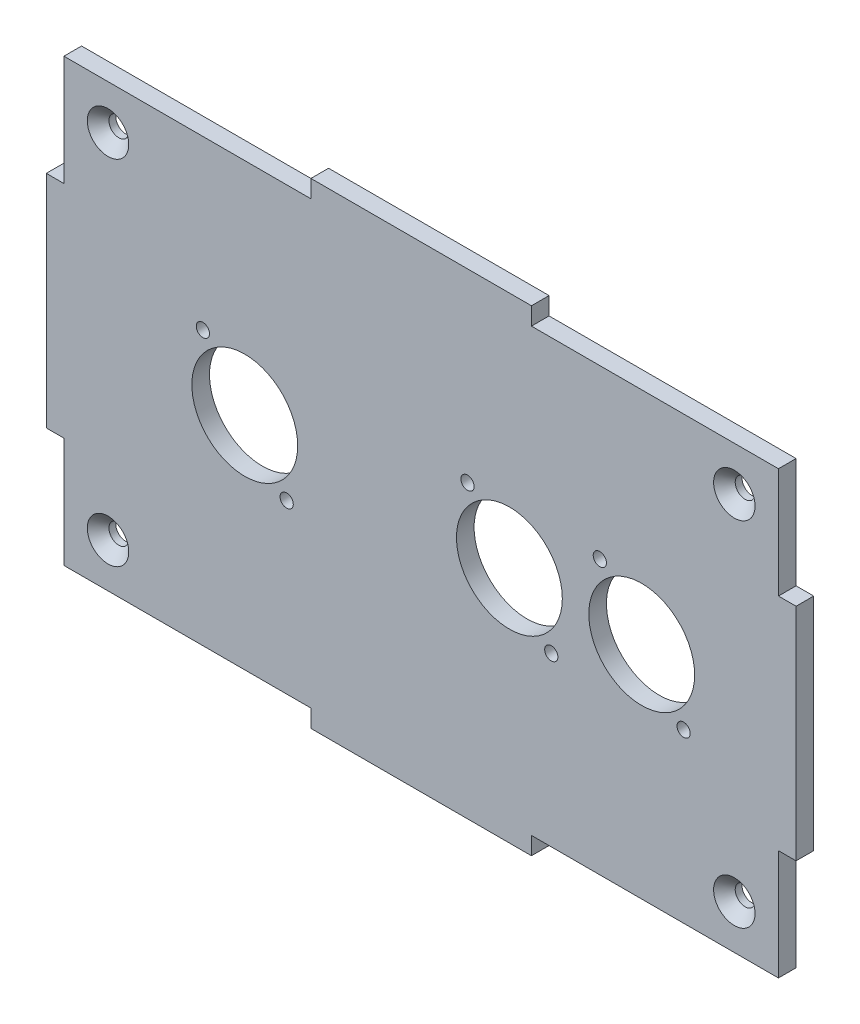
ISO-10303-21;
HEADER;
FILE_DESCRIPTION(('STEP AP214'),'2;1');
FILE_NAME('part.step','',(''),(''),'','','');
FILE_SCHEMA(('AUTOMOTIVE_DESIGN { 1 0 10303 214 1 1 1 1 }'));
ENDSEC;
DATA;
#1=APPLICATION_CONTEXT('core data for automotive mechanical design processes');
#2=APPLICATION_PROTOCOL_DEFINITION('international standard','automotive_design',2000,#1);
#3=PRODUCT_CONTEXT('',#1,'mechanical');
#4=PRODUCT('Part','Part','',(#3));
#5=PRODUCT_RELATED_PRODUCT_CATEGORY('part','',(#4));
#6=PRODUCT_DEFINITION_FORMATION('','',#4);
#7=PRODUCT_DEFINITION_CONTEXT('part definition',#1,'design');
#8=PRODUCT_DEFINITION('design','',#6,#7);
#9=PRODUCT_DEFINITION_SHAPE('','',#8);
#10=(LENGTH_UNIT() NAMED_UNIT(*) SI_UNIT(.MILLI.,.METRE.));
#11=(NAMED_UNIT(*) PLANE_ANGLE_UNIT() SI_UNIT($,.RADIAN.));
#12=(NAMED_UNIT(*) SI_UNIT($,.STERADIAN.) SOLID_ANGLE_UNIT());
#13=UNCERTAINTY_MEASURE_WITH_UNIT(LENGTH_MEASURE(1.E-05),#10,'distance_accuracy_value','');
#14=(GEOMETRIC_REPRESENTATION_CONTEXT(3) GLOBAL_UNCERTAINTY_ASSIGNED_CONTEXT((#13)) GLOBAL_UNIT_ASSIGNED_CONTEXT((#10,
#11,#12)) REPRESENTATION_CONTEXT('',''));
#15=CARTESIAN_POINT('',(0.,0.,0.));
#16=DIRECTION('',(0.,0.,1.));
#17=DIRECTION('',(1.,0.,0.));
#18=AXIS2_PLACEMENT_3D('',#15,#16,#17);
#19=CARTESIAN_POINT('',(0.,-25.,4.));
#20=DIRECTION('',(0.,-1.,0.));
#21=DIRECTION('',(1.,0.,0.));
#22=AXIS2_PLACEMENT_3D('',#19,#20,#21);
#23=PLANE('',#22);
#24=DIRECTION('',(-1.,0.,0.));
#25=VECTOR('',#24,1.);
#26=CARTESIAN_POINT('',(0.,-25.,0.));
#27=LINE('',#26,#25);
#28=CARTESIAN_POINT('',(-81.,-25.,0.));
#29=VERTEX_POINT('',#28);
#30=CARTESIAN_POINT('',(-85.,-25.,0.));
#31=VERTEX_POINT('',#30);
#32=EDGE_CURVE('E208',#29,#31,#27,.T.);
#33=ORIENTED_EDGE('',*,*,#32,.F.);
#34=DIRECTION('',(0.,0.,-1.));
#35=VECTOR('',#34,1.);
#36=CARTESIAN_POINT('',(-81.,-25.,4.));
#37=LINE('',#36,#35);
#38=CARTESIAN_POINT('',(-81.,-25.,4.));
#39=VERTEX_POINT('',#38);
#40=EDGE_CURVE('E214',#39,#29,#37,.T.);
#41=ORIENTED_EDGE('',*,*,#40,.F.);
#42=DIRECTION('',(-1.,0.,0.));
#43=VECTOR('',#42,1.);
#44=CARTESIAN_POINT('',(0.,-25.,4.));
#45=LINE('',#44,#43);
#46=CARTESIAN_POINT('',(-85.,-25.,4.));
#47=VERTEX_POINT('',#46);
#48=EDGE_CURVE('E167',#39,#47,#45,.T.);
#49=ORIENTED_EDGE('',*,*,#48,.T.);
#50=DIRECTION('',(0.,0.,-1.));
#51=VECTOR('',#50,1.);
#52=CARTESIAN_POINT('',(-85.,-25.,4.));
#53=LINE('',#52,#51);
#54=EDGE_CURVE('E217',#47,#31,#53,.T.);
#55=ORIENTED_EDGE('',*,*,#54,.T.);
#56=EDGE_LOOP('',(#33,#41,#49,#55));
#57=FACE_BOUND('',#56,.T.);
#58=ADVANCED_FACE('F35',(#57),#23,.T.);
#59=CARTESIAN_POINT('',(-85.,0.,4.));
#60=DIRECTION('',(1.,0.,0.));
#61=DIRECTION('',(0.,0.,-1.));
#62=AXIS2_PLACEMENT_3D('',#59,#60,#61);
#63=PLANE('',#62);
#64=DIRECTION('',(0.,-1.,0.));
#65=VECTOR('',#64,1.);
#66=CARTESIAN_POINT('',(-85.,0.,0.));
#67=LINE('',#66,#65);
#68=CARTESIAN_POINT('',(-85.,25.,0.));
#69=VERTEX_POINT('',#68);
#70=EDGE_CURVE('E205',#69,#31,#67,.T.);
#71=ORIENTED_EDGE('',*,*,#70,.T.);
#72=ORIENTED_EDGE('',*,*,#54,.F.);
#73=DIRECTION('',(0.,-1.,0.));
#74=VECTOR('',#73,1.);
#75=CARTESIAN_POINT('',(-85.,0.,4.));
#76=LINE('',#75,#74);
#77=CARTESIAN_POINT('',(-85.,25.,4.));
#78=VERTEX_POINT('',#77);
#79=EDGE_CURVE('E164',#78,#47,#76,.T.);
#80=ORIENTED_EDGE('',*,*,#79,.F.);
#81=DIRECTION('',(0.,0.,-1.));
#82=VECTOR('',#81,1.);
#83=CARTESIAN_POINT('',(-85.,25.,4.));
#84=LINE('',#83,#82);
#85=EDGE_CURVE('E220',#78,#69,#84,.T.);
#86=ORIENTED_EDGE('',*,*,#85,.T.);
#87=EDGE_LOOP('',(#71,#72,#80,#86));
#88=FACE_BOUND('',#87,.T.);
#89=ADVANCED_FACE('F360',(#88),#63,.F.);
#90=CARTESIAN_POINT('',(0.,25.,4.));
#91=DIRECTION('',(0.,-1.,0.));
#92=DIRECTION('',(1.,0.,0.));
#93=AXIS2_PLACEMENT_3D('',#90,#91,#92);
#94=PLANE('',#93);
#95=DIRECTION('',(-1.,0.,0.));
#96=VECTOR('',#95,1.);
#97=CARTESIAN_POINT('',(0.,25.,0.));
#98=LINE('',#97,#96);
#99=CARTESIAN_POINT('',(-81.,25.,0.));
#100=VERTEX_POINT('',#99);
#101=EDGE_CURVE('E201',#100,#69,#98,.T.);
#102=ORIENTED_EDGE('',*,*,#101,.T.);
#103=ORIENTED_EDGE('',*,*,#85,.F.);
#104=DIRECTION('',(-1.,0.,0.));
#105=VECTOR('',#104,1.);
#106=CARTESIAN_POINT('',(0.,25.,4.));
#107=LINE('',#106,#105);
#108=CARTESIAN_POINT('',(-81.,25.,4.));
#109=VERTEX_POINT('',#108);
#110=EDGE_CURVE('E160',#109,#78,#107,.T.);
#111=ORIENTED_EDGE('',*,*,#110,.F.);
#112=DIRECTION('',(0.,0.,-1.));
#113=VECTOR('',#112,1.);
#114=CARTESIAN_POINT('',(-81.,25.,4.));
#115=LINE('',#114,#113);
#116=EDGE_CURVE('E223',#109,#100,#115,.T.);
#117=ORIENTED_EDGE('',*,*,#116,.T.);
#118=EDGE_LOOP('',(#102,#103,#111,#117));
#119=FACE_BOUND('',#118,.T.);
#120=ADVANCED_FACE('F414',(#119),#94,.F.);
#121=CARTESIAN_POINT('',(-81.,0.,4.));
#122=DIRECTION('',(-1.,0.,0.));
#123=DIRECTION('',(0.,0.,1.));
#124=AXIS2_PLACEMENT_3D('',#121,#122,#123);
#125=PLANE('',#124);
#126=DIRECTION('',(0.,1.,0.));
#127=VECTOR('',#126,1.);
#128=CARTESIAN_POINT('',(-81.,0.,0.));
#129=LINE('',#128,#127);
#130=CARTESIAN_POINT('',(-81.,50.,0.));
#131=VERTEX_POINT('',#130);
#132=EDGE_CURVE('E198',#100,#131,#129,.T.);
#133=ORIENTED_EDGE('',*,*,#132,.F.);
#134=ORIENTED_EDGE('',*,*,#116,.F.);
#135=DIRECTION('',(0.,1.,0.));
#136=VECTOR('',#135,1.);
#137=CARTESIAN_POINT('',(-81.,0.,4.));
#138=LINE('',#137,#136);
#139=CARTESIAN_POINT('',(-81.,50.,4.));
#140=VERTEX_POINT('',#139);
#141=EDGE_CURVE('E157',#109,#140,#138,.T.);
#142=ORIENTED_EDGE('',*,*,#141,.T.);
#143=DIRECTION('',(0.,0.,-1.));
#144=VECTOR('',#143,1.);
#145=CARTESIAN_POINT('',(-81.,50.,4.));
#146=LINE('',#145,#144);
#147=EDGE_CURVE('E226',#140,#131,#146,.T.);
#148=ORIENTED_EDGE('',*,*,#147,.T.);
#149=EDGE_LOOP('',(#133,#134,#142,#148));
#150=FACE_BOUND('',#149,.T.);
#151=ADVANCED_FACE('F374',(#150),#125,.T.);
#152=CARTESIAN_POINT('',(0.,50.,4.));
#153=DIRECTION('',(0.,1.,0.));
#154=DIRECTION('',(0.,0.,1.));
#155=AXIS2_PLACEMENT_3D('',#152,#153,#154);
#156=PLANE('',#155);
#157=DIRECTION('',(1.,0.,0.));
#158=VECTOR('',#157,1.);
#159=CARTESIAN_POINT('',(0.,50.,0.));
#160=LINE('',#159,#158);
#161=CARTESIAN_POINT('',(-25.,50.,0.));
#162=VERTEX_POINT('',#161);
#163=EDGE_CURVE('E189',#131,#162,#160,.T.);
#164=ORIENTED_EDGE('',*,*,#163,.F.);
#165=ORIENTED_EDGE('',*,*,#147,.F.);
#166=DIRECTION('',(1.,0.,0.));
#167=VECTOR('',#166,1.);
#168=CARTESIAN_POINT('',(0.,50.,4.));
#169=LINE('',#168,#167);
#170=CARTESIAN_POINT('',(-25.,50.,4.));
#171=VERTEX_POINT('',#170);
#172=EDGE_CURVE('E148',#140,#171,#169,.T.);
#173=ORIENTED_EDGE('',*,*,#172,.T.);
#174=DIRECTION('',(0.,0.,-1.));
#175=VECTOR('',#174,1.);
#176=CARTESIAN_POINT('',(-25.,50.,4.));
#177=LINE('',#176,#175);
#178=EDGE_CURVE('E229',#171,#162,#177,.T.);
#179=ORIENTED_EDGE('',*,*,#178,.T.);
#180=EDGE_LOOP('',(#164,#165,#173,#179));
#181=FACE_BOUND('',#180,.T.);
#182=ADVANCED_FACE('F379',(#181),#156,.T.);
#183=CARTESIAN_POINT('',(-25.,0.,4.));
#184=DIRECTION('',(-1.,0.,0.));
#185=DIRECTION('',(0.,0.,1.));
#186=AXIS2_PLACEMENT_3D('',#183,#184,#185);
#187=PLANE('',#186);
#188=DIRECTION('',(0.,1.,0.));
#189=VECTOR('',#188,1.);
#190=CARTESIAN_POINT('',(-25.,0.,0.));
#191=LINE('',#190,#189);
#192=CARTESIAN_POINT('',(-25.,54.,0.));
#193=VERTEX_POINT('',#192);
#194=EDGE_CURVE('E195',#162,#193,#191,.T.);
#195=ORIENTED_EDGE('',*,*,#194,.F.);
#196=ORIENTED_EDGE('',*,*,#178,.F.);
#197=DIRECTION('',(0.,1.,0.));
#198=VECTOR('',#197,1.);
#199=CARTESIAN_POINT('',(-25.,0.,4.));
#200=LINE('',#199,#198);
#201=CARTESIAN_POINT('',(-25.,54.,4.));
#202=VERTEX_POINT('',#201);
#203=EDGE_CURVE('E154',#171,#202,#200,.T.);
#204=ORIENTED_EDGE('',*,*,#203,.T.);
#205=DIRECTION('',(0.,0.,-1.));
#206=VECTOR('',#205,1.);
#207=CARTESIAN_POINT('',(-25.,54.,4.));
#208=LINE('',#207,#206);
#209=EDGE_CURVE('E232',#202,#193,#208,.T.);
#210=ORIENTED_EDGE('',*,*,#209,.T.);
#211=EDGE_LOOP('',(#195,#196,#204,#210));
#212=FACE_BOUND('',#211,.T.);
#213=ADVANCED_FACE('F384',(#212),#187,.T.);
#214=CARTESIAN_POINT('',(0.,54.,4.));
#215=DIRECTION('',(0.,1.,0.));
#216=DIRECTION('',(-1.,0.,0.));
#217=AXIS2_PLACEMENT_3D('',#214,#215,#216);
#218=PLANE('',#217);
#219=DIRECTION('',(1.,0.,0.));
#220=VECTOR('',#219,1.);
#221=CARTESIAN_POINT('',(0.,54.,0.));
#222=LINE('',#221,#220);
#223=CARTESIAN_POINT('',(25.,54.,0.));
#224=VERTEX_POINT('',#223);
#225=EDGE_CURVE('E192',#193,#224,#222,.T.);
#226=ORIENTED_EDGE('',*,*,#225,.F.);
#227=ORIENTED_EDGE('',*,*,#209,.F.);
#228=DIRECTION('',(1.,0.,0.));
#229=VECTOR('',#228,1.);
#230=CARTESIAN_POINT('',(0.,54.,4.));
#231=LINE('',#230,#229);
#232=CARTESIAN_POINT('',(25.,54.,4.));
#233=VERTEX_POINT('',#232);
#234=EDGE_CURVE('E151',#202,#233,#231,.T.);
#235=ORIENTED_EDGE('',*,*,#234,.T.);
#236=DIRECTION('',(0.,0.,-1.));
#237=VECTOR('',#236,1.);
#238=CARTESIAN_POINT('',(25.,54.,4.));
#239=LINE('',#238,#237);
#240=EDGE_CURVE('E235',#233,#224,#239,.T.);
#241=ORIENTED_EDGE('',*,*,#240,.T.);
#242=EDGE_LOOP('',(#226,#227,#235,#241));
#243=FACE_BOUND('',#242,.T.);
#244=ADVANCED_FACE('F388',(#243),#218,.T.);
#245=CARTESIAN_POINT('',(25.,0.,4.));
#246=DIRECTION('',(-1.,0.,0.));
#247=DIRECTION('',(0.,0.,1.));
#248=AXIS2_PLACEMENT_3D('',#245,#246,#247);
#249=PLANE('',#248);
#250=DIRECTION('',(0.,1.,0.));
#251=VECTOR('',#250,1.);
#252=CARTESIAN_POINT('',(25.,0.,0.));
#253=LINE('',#252,#251);
#254=CARTESIAN_POINT('',(25.,50.,0.));
#255=VERTEX_POINT('',#254);
#256=EDGE_CURVE('E188',#255,#224,#253,.T.);
#257=ORIENTED_EDGE('',*,*,#256,.T.);
#258=ORIENTED_EDGE('',*,*,#240,.F.);
#259=DIRECTION('',(0.,1.,0.));
#260=VECTOR('',#259,1.);
#261=CARTESIAN_POINT('',(25.,0.,4.));
#262=LINE('',#261,#260);
#263=CARTESIAN_POINT('',(25.,50.,4.));
#264=VERTEX_POINT('',#263);
#265=EDGE_CURVE('E147',#264,#233,#262,.T.);
#266=ORIENTED_EDGE('',*,*,#265,.F.);
#267=DIRECTION('',(0.,0.,-1.));
#268=VECTOR('',#267,1.);
#269=CARTESIAN_POINT('',(25.,50.,4.));
#270=LINE('',#269,#268);
#271=EDGE_CURVE('E238',#264,#255,#270,.T.);
#272=ORIENTED_EDGE('',*,*,#271,.T.);
#273=EDGE_LOOP('',(#257,#258,#266,#272));
#274=FACE_BOUND('',#273,.T.);
#275=ADVANCED_FACE('F392',(#274),#249,.F.);
#276=CARTESIAN_POINT('',(81.,50.,0.));
#277=VERTEX_POINT('',#276);
#278=EDGE_CURVE('E185',#255,#277,#160,.T.);
#279=ORIENTED_EDGE('',*,*,#278,.F.);
#280=ORIENTED_EDGE('',*,*,#271,.F.);
#281=CARTESIAN_POINT('',(81.,50.,4.));
#282=VERTEX_POINT('',#281);
#283=EDGE_CURVE('E144',#264,#282,#169,.T.);
#284=ORIENTED_EDGE('',*,*,#283,.T.);
#285=DIRECTION('',(0.,0.,-1.));
#286=VECTOR('',#285,1.);
#287=CARTESIAN_POINT('',(81.,50.,4.));
#288=LINE('',#287,#286);
#289=EDGE_CURVE('E241',#282,#277,#288,.T.);
#290=ORIENTED_EDGE('',*,*,#289,.T.);
#291=EDGE_LOOP('',(#279,#280,#284,#290));
#292=FACE_BOUND('',#291,.T.);
#293=ADVANCED_FACE('F395',(#292),#156,.T.);
#294=CARTESIAN_POINT('',(81.,0.,4.));
#295=DIRECTION('',(-1.,0.,0.));
#296=DIRECTION('',(0.,0.,1.));
#297=AXIS2_PLACEMENT_3D('',#294,#295,#296);
#298=PLANE('',#297);
#299=DIRECTION('',(0.,1.,0.));
#300=VECTOR('',#299,1.);
#301=CARTESIAN_POINT('',(81.,0.,0.));
#302=LINE('',#301,#300);
#303=CARTESIAN_POINT('',(81.,25.,0.));
#304=VERTEX_POINT('',#303);
#305=EDGE_CURVE('E176',#304,#277,#302,.T.);
#306=ORIENTED_EDGE('',*,*,#305,.T.);
#307=ORIENTED_EDGE('',*,*,#289,.F.);
#308=DIRECTION('',(0.,1.,0.));
#309=VECTOR('',#308,1.);
#310=CARTESIAN_POINT('',(81.,0.,4.));
#311=LINE('',#310,#309);
#312=CARTESIAN_POINT('',(81.,25.,4.));
#313=VERTEX_POINT('',#312);
#314=EDGE_CURVE('E135',#313,#282,#311,.T.);
#315=ORIENTED_EDGE('',*,*,#314,.F.);
#316=DIRECTION('',(0.,0.,-1.));
#317=VECTOR('',#316,1.);
#318=CARTESIAN_POINT('',(81.,25.,4.));
#319=LINE('',#318,#317);
#320=EDGE_CURVE('E244',#313,#304,#319,.T.);
#321=ORIENTED_EDGE('',*,*,#320,.T.);
#322=EDGE_LOOP('',(#306,#307,#315,#321));
#323=FACE_BOUND('',#322,.T.);
#324=ADVANCED_FACE('F398',(#323),#298,.F.);
#325=CARTESIAN_POINT('',(0.,24.9999999999999,4.));
#326=DIRECTION('',(0.,1.,0.));
#327=DIRECTION('',(-1.,0.,0.));
#328=AXIS2_PLACEMENT_3D('',#325,#326,#327);
#329=PLANE('',#328);
#330=DIRECTION('',(1.,0.,0.));
#331=VECTOR('',#330,1.);
#332=CARTESIAN_POINT('',(0.,24.9999999999999,0.));
#333=LINE('',#332,#331);
#334=CARTESIAN_POINT('',(85.,25.,0.));
#335=VERTEX_POINT('',#334);
#336=EDGE_CURVE('E182',#304,#335,#333,.T.);
#337=ORIENTED_EDGE('',*,*,#336,.F.);
#338=ORIENTED_EDGE('',*,*,#320,.F.);
#339=DIRECTION('',(1.,0.,0.));
#340=VECTOR('',#339,1.);
#341=CARTESIAN_POINT('',(0.,24.9999999999999,4.));
#342=LINE('',#341,#340);
#343=CARTESIAN_POINT('',(85.,25.,4.));
#344=VERTEX_POINT('',#343);
#345=EDGE_CURVE('E141',#313,#344,#342,.T.);
#346=ORIENTED_EDGE('',*,*,#345,.T.);
#347=DIRECTION('',(0.,0.,-1.));
#348=VECTOR('',#347,1.);
#349=CARTESIAN_POINT('',(85.,25.,4.));
#350=LINE('',#349,#348);
#351=EDGE_CURVE('E247',#344,#335,#350,.T.);
#352=ORIENTED_EDGE('',*,*,#351,.T.);
#353=EDGE_LOOP('',(#337,#338,#346,#352));
#354=FACE_BOUND('',#353,.T.);
#355=ADVANCED_FACE('F273',(#354),#329,.T.);
#356=CARTESIAN_POINT('',(85.,0.,4.));
#357=DIRECTION('',(1.,0.,0.));
#358=DIRECTION('',(0.,0.,-1.));
#359=AXIS2_PLACEMENT_3D('',#356,#357,#358);
#360=PLANE('',#359);
#361=DIRECTION('',(0.,-1.,0.));
#362=VECTOR('',#361,1.);
#363=CARTESIAN_POINT('',(85.,0.,0.));
#364=LINE('',#363,#362);
#365=CARTESIAN_POINT('',(85.,-25.,0.));
#366=VERTEX_POINT('',#365);
#367=EDGE_CURVE('E179',#335,#366,#364,.T.);
#368=ORIENTED_EDGE('',*,*,#367,.F.);
#369=ORIENTED_EDGE('',*,*,#351,.F.);
#370=DIRECTION('',(0.,-1.,0.));
#371=VECTOR('',#370,1.);
#372=CARTESIAN_POINT('',(85.,0.,4.));
#373=LINE('',#372,#371);
#374=CARTESIAN_POINT('',(85.,-25.,4.));
#375=VERTEX_POINT('',#374);
#376=EDGE_CURVE('E138',#344,#375,#373,.T.);
#377=ORIENTED_EDGE('',*,*,#376,.T.);
#378=DIRECTION('',(0.,0.,-1.));
#379=VECTOR('',#378,1.);
#380=CARTESIAN_POINT('',(85.,-25.,4.));
#381=LINE('',#380,#379);
#382=EDGE_CURVE('E110',#375,#366,#381,.T.);
#383=ORIENTED_EDGE('',*,*,#382,.T.);
#384=EDGE_LOOP('',(#368,#369,#377,#383));
#385=FACE_BOUND('',#384,.T.);
#386=ADVANCED_FACE('F254',(#385),#360,.T.);
#387=CARTESIAN_POINT('',(0.,-24.9999999999999,4.));
#388=DIRECTION('',(0.,1.,0.));
#389=DIRECTION('',(-1.,0.,0.));
#390=AXIS2_PLACEMENT_3D('',#387,#388,#389);
#391=PLANE('',#390);
#392=DIRECTION('',(1.,0.,0.));
#393=VECTOR('',#392,1.);
#394=CARTESIAN_POINT('',(0.,-24.9999999999999,0.));
#395=LINE('',#394,#393);
#396=CARTESIAN_POINT('',(81.,-25.,0.));
#397=VERTEX_POINT('',#396);
#398=EDGE_CURVE('E175',#397,#366,#395,.T.);
#399=ORIENTED_EDGE('',*,*,#398,.T.);
#400=ORIENTED_EDGE('',*,*,#382,.F.);
#401=DIRECTION('',(1.,0.,0.));
#402=VECTOR('',#401,1.);
#403=CARTESIAN_POINT('',(0.,-24.9999999999999,4.));
#404=LINE('',#403,#402);
#405=CARTESIAN_POINT('',(81.,-25.,4.));
#406=VERTEX_POINT('',#405);
#407=EDGE_CURVE('E134',#406,#375,#404,.T.);
#408=ORIENTED_EDGE('',*,*,#407,.F.);
#409=DIRECTION('',(0.,0.,-1.));
#410=VECTOR('',#409,1.);
#411=CARTESIAN_POINT('',(81.,-25.,4.));
#412=LINE('',#411,#410);
#413=EDGE_CURVE('E103',#406,#397,#412,.T.);
#414=ORIENTED_EDGE('',*,*,#413,.T.);
#415=EDGE_LOOP('',(#399,#400,#408,#414));
#416=FACE_BOUND('',#415,.T.);
#417=ADVANCED_FACE('F264',(#416),#391,.F.);
#418=CARTESIAN_POINT('',(-81.,-50.,0.));
#419=VERTEX_POINT('',#418);
#420=EDGE_CURVE('E202',#419,#29,#129,.T.);
#421=ORIENTED_EDGE('',*,*,#420,.F.);
#422=DIRECTION('',(0.,0.,-1.));
#423=VECTOR('',#422,1.);
#424=CARTESIAN_POINT('',(-81.,-50.,4.));
#425=LINE('',#424,#423);
#426=CARTESIAN_POINT('',(-81.,-50.,4.));
#427=VERTEX_POINT('',#426);
#428=EDGE_CURVE('E211',#427,#419,#425,.T.);
#429=ORIENTED_EDGE('',*,*,#428,.F.);
#430=EDGE_CURVE('E161',#427,#39,#138,.T.);
#431=ORIENTED_EDGE('',*,*,#430,.T.);
#432=ORIENTED_EDGE('',*,*,#40,.T.);
#433=EDGE_LOOP('',(#421,#429,#431,#432));
#434=FACE_BOUND('',#433,.T.);
#435=ADVANCED_FACE('F365',(#434),#125,.T.);
#436=CARTESIAN_POINT('',(81.,-50.,0.));
#437=VERTEX_POINT('',#436);
#438=EDGE_CURVE('E173',#437,#397,#302,.T.);
#439=ORIENTED_EDGE('',*,*,#438,.T.);
#440=ORIENTED_EDGE('',*,*,#413,.F.);
#441=CARTESIAN_POINT('',(81.,-50.,4.));
#442=VERTEX_POINT('',#441);
#443=EDGE_CURVE('E130',#442,#406,#311,.T.);
#444=ORIENTED_EDGE('',*,*,#443,.F.);
#445=DIRECTION('',(0.,0.,-1.));
#446=VECTOR('',#445,1.);
#447=CARTESIAN_POINT('',(81.,-50.,4.));
#448=LINE('',#447,#446);
#449=EDGE_CURVE('E99',#442,#437,#448,.T.);
#450=ORIENTED_EDGE('',*,*,#449,.T.);
#451=EDGE_LOOP('',(#439,#440,#444,#450));
#452=FACE_BOUND('',#451,.T.);
#453=ADVANCED_FACE('F318',(#452),#298,.F.);
#454=CARTESIAN_POINT('',(0.,0.,0.));
#455=DIRECTION('',(0.,0.,1.));
#456=DIRECTION('',(1.,0.,0.));
#457=AXIS2_PLACEMENT_3D('',#454,#455,#456);
#458=PLANE('',#457);
#459=CARTESIAN_POINT('',(-49.5,12.,0.));
#460=DIRECTION('',(0.,0.,1.));
#461=DIRECTION('',(1.,0.,0.));
#462=AXIS2_PLACEMENT_3D('',#459,#460,#461);
#463=CIRCLE('',#462,1.49999999999999);
#464=CARTESIAN_POINT('',(-48.,12.,0.));
#465=VERTEX_POINT('',#464);
#466=EDGE_CURVE('E714',#465,#465,#463,.T.);
#467=ORIENTED_EDGE('',*,*,#466,.T.);
#468=EDGE_LOOP('',(#467));
#469=FACE_BOUND('',#468,.T.);
#470=CARTESIAN_POINT('',(-30.5,-12.,0.));
#471=DIRECTION('',(0.,0.,1.));
#472=DIRECTION('',(1.,0.,0.));
#473=AXIS2_PLACEMENT_3D('',#470,#471,#472);
#474=CIRCLE('',#473,1.49999999999999);
#475=CARTESIAN_POINT('',(-29.,-12.,0.));
#476=VERTEX_POINT('',#475);
#477=EDGE_CURVE('E724',#476,#476,#474,.T.);
#478=ORIENTED_EDGE('',*,*,#477,.T.);
#479=EDGE_LOOP('',(#478));
#480=FACE_BOUND('',#479,.T.);
#481=CARTESIAN_POINT('',(10.5,12.,0.));
#482=DIRECTION('',(0.,0.,1.));
#483=DIRECTION('',(1.,0.,0.));
#484=AXIS2_PLACEMENT_3D('',#481,#482,#483);
#485=CIRCLE('',#484,1.49999999999999);
#486=CARTESIAN_POINT('',(12.,12.,0.));
#487=VERTEX_POINT('',#486);
#488=EDGE_CURVE('E730',#487,#487,#485,.T.);
#489=ORIENTED_EDGE('',*,*,#488,.T.);
#490=EDGE_LOOP('',(#489));
#491=FACE_BOUND('',#490,.T.);
#492=CARTESIAN_POINT('',(29.5,-12.,0.));
#493=DIRECTION('',(0.,0.,1.));
#494=DIRECTION('',(1.,0.,0.));
#495=AXIS2_PLACEMENT_3D('',#492,#493,#494);
#496=CIRCLE('',#495,1.49999999999999);
#497=CARTESIAN_POINT('',(31.,-12.,0.));
#498=VERTEX_POINT('',#497);
#499=EDGE_CURVE('E736',#498,#498,#496,.T.);
#500=ORIENTED_EDGE('',*,*,#499,.T.);
#501=EDGE_LOOP('',(#500));
#502=FACE_BOUND('',#501,.T.);
#503=CARTESIAN_POINT('',(40.5,12.,0.));
#504=DIRECTION('',(0.,0.,1.));
#505=DIRECTION('',(1.,0.,0.));
#506=AXIS2_PLACEMENT_3D('',#503,#504,#505);
#507=CIRCLE('',#506,1.49999999999999);
#508=CARTESIAN_POINT('',(42.,12.,0.));
#509=VERTEX_POINT('',#508);
#510=EDGE_CURVE('E742',#509,#509,#507,.T.);
#511=ORIENTED_EDGE('',*,*,#510,.T.);
#512=EDGE_LOOP('',(#511));
#513=FACE_BOUND('',#512,.T.);
#514=CARTESIAN_POINT('',(59.5,-12.,0.));
#515=DIRECTION('',(0.,0.,1.));
#516=DIRECTION('',(1.,0.,0.));
#517=AXIS2_PLACEMENT_3D('',#514,#515,#516);
#518=CIRCLE('',#517,1.49999999999999);
#519=CARTESIAN_POINT('',(61.,-12.,0.));
#520=VERTEX_POINT('',#519);
#521=EDGE_CURVE('E748',#520,#520,#518,.T.);
#522=ORIENTED_EDGE('',*,*,#521,.T.);
#523=EDGE_LOOP('',(#522));
#524=FACE_BOUND('',#523,.T.);
#525=CARTESIAN_POINT('',(-71.,40.,0.));
#526=DIRECTION('',(0.,0.,1.));
#527=DIRECTION('',(1.,0.,0.));
#528=AXIS2_PLACEMENT_3D('',#525,#526,#527);
#529=CIRCLE('',#528,2.25);
#530=CARTESIAN_POINT('',(-68.75,40.,0.));
#531=VERTEX_POINT('',#530);
#532=EDGE_CURVE('E757',#531,#531,#529,.T.);
#533=ORIENTED_EDGE('',*,*,#532,.T.);
#534=EDGE_LOOP('',(#533));
#535=FACE_BOUND('',#534,.T.);
#536=CARTESIAN_POINT('',(71.,40.,0.));
#537=DIRECTION('',(0.,0.,1.));
#538=DIRECTION('',(1.,0.,0.));
#539=AXIS2_PLACEMENT_3D('',#536,#537,#538);
#540=CIRCLE('',#539,2.25);
#541=CARTESIAN_POINT('',(73.25,40.,0.));
#542=VERTEX_POINT('',#541);
#543=EDGE_CURVE('E766',#542,#542,#540,.T.);
#544=ORIENTED_EDGE('',*,*,#543,.T.);
#545=EDGE_LOOP('',(#544));
#546=FACE_BOUND('',#545,.T.);
#547=CARTESIAN_POINT('',(71.,-40.,0.));
#548=DIRECTION('',(0.,0.,1.));
#549=DIRECTION('',(1.,0.,0.));
#550=AXIS2_PLACEMENT_3D('',#547,#548,#549);
#551=CIRCLE('',#550,2.25);
#552=CARTESIAN_POINT('',(73.25,-40.,0.));
#553=VERTEX_POINT('',#552);
#554=EDGE_CURVE('E775',#553,#553,#551,.T.);
#555=ORIENTED_EDGE('',*,*,#554,.T.);
#556=EDGE_LOOP('',(#555));
#557=FACE_BOUND('',#556,.T.);
#558=CARTESIAN_POINT('',(-71.,-40.,0.));
#559=DIRECTION('',(0.,0.,1.));
#560=DIRECTION('',(1.,0.,0.));
#561=AXIS2_PLACEMENT_3D('',#558,#559,#560);
#562=CIRCLE('',#561,2.25);
#563=CARTESIAN_POINT('',(-68.75,-40.,0.));
#564=VERTEX_POINT('',#563);
#565=EDGE_CURVE('E784',#564,#564,#562,.T.);
#566=ORIENTED_EDGE('',*,*,#565,.T.);
#567=EDGE_LOOP('',(#566));
#568=FACE_BOUND('',#567,.T.);
#569=CARTESIAN_POINT('',(-40.,0.,0.));
#570=DIRECTION('',(0.,0.,1.));
#571=DIRECTION('',(1.,0.,0.));
#572=AXIS2_PLACEMENT_3D('',#569,#570,#571);
#573=CIRCLE('',#572,12.);
#574=CARTESIAN_POINT('',(-28.,0.,0.));
#575=VERTEX_POINT('',#574);
#576=EDGE_CURVE('E791',#575,#575,#573,.F.);
#577=ORIENTED_EDGE('',*,*,#576,.F.);
#578=EDGE_LOOP('',(#577));
#579=FACE_BOUND('',#578,.T.);
#580=CARTESIAN_POINT('',(50.,0.,0.));
#581=DIRECTION('',(0.,0.,1.));
#582=DIRECTION('',(1.,0.,0.));
#583=AXIS2_PLACEMENT_3D('',#580,#581,#582);
#584=CIRCLE('',#583,12.);
#585=CARTESIAN_POINT('',(62.,0.,0.));
#586=VERTEX_POINT('',#585);
#587=EDGE_CURVE('E123',#586,#586,#584,.F.);
#588=ORIENTED_EDGE('',*,*,#587,.F.);
#589=EDGE_LOOP('',(#588));
#590=FACE_BOUND('',#589,.T.);
#591=CARTESIAN_POINT('',(20.,0.,0.));
#592=DIRECTION('',(0.,0.,1.));
#593=DIRECTION('',(1.,0.,0.));
#594=AXIS2_PLACEMENT_3D('',#591,#592,#593);
#595=CIRCLE('',#594,12.);
#596=CARTESIAN_POINT('',(32.,0.,0.));
#597=VERTEX_POINT('',#596);
#598=EDGE_CURVE('E115',#597,#597,#595,.F.);
#599=ORIENTED_EDGE('',*,*,#598,.F.);
#600=EDGE_LOOP('',(#599));
#601=FACE_BOUND('',#600,.T.);
#602=DIRECTION('',(1.,0.,0.));
#603=VECTOR('',#602,1.);
#604=CARTESIAN_POINT('',(0.,-50.,0.));
#605=LINE('',#604,#603);
#606=CARTESIAN_POINT('',(-25.,-50.,0.));
#607=VERTEX_POINT('',#606);
#608=EDGE_CURVE('E170',#419,#607,#605,.T.);
#609=ORIENTED_EDGE('',*,*,#608,.F.);
#610=ORIENTED_EDGE('',*,*,#420,.T.);
#611=ORIENTED_EDGE('',*,*,#32,.T.);
#612=ORIENTED_EDGE('',*,*,#70,.F.);
#613=ORIENTED_EDGE('',*,*,#101,.F.);
#614=ORIENTED_EDGE('',*,*,#132,.T.);
#615=ORIENTED_EDGE('',*,*,#163,.T.);
#616=ORIENTED_EDGE('',*,*,#194,.T.);
#617=ORIENTED_EDGE('',*,*,#225,.T.);
#618=ORIENTED_EDGE('',*,*,#256,.F.);
#619=ORIENTED_EDGE('',*,*,#278,.T.);
#620=ORIENTED_EDGE('',*,*,#305,.F.);
#621=ORIENTED_EDGE('',*,*,#336,.T.);
#622=ORIENTED_EDGE('',*,*,#367,.T.);
#623=ORIENTED_EDGE('',*,*,#398,.F.);
#624=ORIENTED_EDGE('',*,*,#438,.F.);
#625=CARTESIAN_POINT('',(25.,-50.,0.));
#626=VERTEX_POINT('',#625);
#627=EDGE_CURVE('E91',#626,#437,#605,.T.);
#628=ORIENTED_EDGE('',*,*,#627,.F.);
#629=DIRECTION('',(0.,-1.,0.));
#630=VECTOR('',#629,1.);
#631=CARTESIAN_POINT('',(25.,-50.,0.));
#632=LINE('',#631,#630);
#633=CARTESIAN_POINT('',(25.,-54.,0.));
#634=VERTEX_POINT('',#633);
#635=EDGE_CURVE('E78',#626,#634,#632,.T.);
#636=ORIENTED_EDGE('',*,*,#635,.T.);
#637=DIRECTION('',(1.,0.,0.));
#638=VECTOR('',#637,1.);
#639=CARTESIAN_POINT('',(-25.,-54.,0.));
#640=LINE('',#639,#638);
#641=CARTESIAN_POINT('',(-25.,-54.,0.));
#642=VERTEX_POINT('',#641);
#643=EDGE_CURVE('E72',#642,#634,#640,.T.);
#644=ORIENTED_EDGE('',*,*,#643,.F.);
#645=DIRECTION('',(0.,-1.,0.));
#646=VECTOR('',#645,1.);
#647=CARTESIAN_POINT('',(-25.,-50.,0.));
#648=LINE('',#647,#646);
#649=EDGE_CURVE('E85',#607,#642,#648,.T.);
#650=ORIENTED_EDGE('',*,*,#649,.F.);
#651=EDGE_LOOP('',(#609,#610,#611,#612,#613,#614,#615,#616,#617,#618,#619,#620,#621,#622,#623,
#624,#628,#636,#644,#650));
#652=FACE_BOUND('',#651,.T.);
#653=ADVANCED_FACE('F88',(#469,#480,#491,#502,#513,#524,#535,#546,#557,#568,#579,#590,#601,
#652),#458,.F.);
#654=CARTESIAN_POINT('',(0.,0.,4.));
#655=DIRECTION('',(0.,0.,1.));
#656=DIRECTION('',(1.,0.,0.));
#657=AXIS2_PLACEMENT_3D('',#654,#655,#656);
#658=PLANE('',#657);
#659=CARTESIAN_POINT('',(-49.5,12.,4.));
#660=DIRECTION('',(0.,0.,1.));
#661=DIRECTION('',(1.,0.,0.));
#662=AXIS2_PLACEMENT_3D('',#659,#660,#661);
#663=CIRCLE('',#662,1.49999999999999);
#664=CARTESIAN_POINT('',(-48.,12.,4.));
#665=VERTEX_POINT('',#664);
#666=EDGE_CURVE('E717',#665,#665,#663,.T.);
#667=ORIENTED_EDGE('',*,*,#666,.F.);
#668=EDGE_LOOP('',(#667));
#669=FACE_BOUND('',#668,.T.);
#670=CARTESIAN_POINT('',(-30.5,-12.,4.));
#671=DIRECTION('',(0.,0.,1.));
#672=DIRECTION('',(1.,0.,0.));
#673=AXIS2_PLACEMENT_3D('',#670,#671,#672);
#674=CIRCLE('',#673,1.49999999999999);
#675=CARTESIAN_POINT('',(-29.,-12.,4.));
#676=VERTEX_POINT('',#675);
#677=EDGE_CURVE('E719',#676,#676,#674,.T.);
#678=ORIENTED_EDGE('',*,*,#677,.F.);
#679=EDGE_LOOP('',(#678));
#680=FACE_BOUND('',#679,.T.);
#681=CARTESIAN_POINT('',(10.5,12.,4.));
#682=DIRECTION('',(0.,0.,1.));
#683=DIRECTION('',(1.,0.,0.));
#684=AXIS2_PLACEMENT_3D('',#681,#682,#683);
#685=CIRCLE('',#684,1.49999999999999);
#686=CARTESIAN_POINT('',(12.,12.,4.));
#687=VERTEX_POINT('',#686);
#688=EDGE_CURVE('E727',#687,#687,#685,.T.);
#689=ORIENTED_EDGE('',*,*,#688,.F.);
#690=EDGE_LOOP('',(#689));
#691=FACE_BOUND('',#690,.T.);
#692=CARTESIAN_POINT('',(29.5,-12.,4.));
#693=DIRECTION('',(0.,0.,1.));
#694=DIRECTION('',(1.,0.,0.));
#695=AXIS2_PLACEMENT_3D('',#692,#693,#694);
#696=CIRCLE('',#695,1.49999999999999);
#697=CARTESIAN_POINT('',(31.,-12.,4.));
#698=VERTEX_POINT('',#697);
#699=EDGE_CURVE('E733',#698,#698,#696,.T.);
#700=ORIENTED_EDGE('',*,*,#699,.F.);
#701=EDGE_LOOP('',(#700));
#702=FACE_BOUND('',#701,.T.);
#703=CARTESIAN_POINT('',(40.5,12.,4.));
#704=DIRECTION('',(0.,0.,1.));
#705=DIRECTION('',(1.,0.,0.));
#706=AXIS2_PLACEMENT_3D('',#703,#704,#705);
#707=CIRCLE('',#706,1.49999999999999);
#708=CARTESIAN_POINT('',(42.,12.,4.));
#709=VERTEX_POINT('',#708);
#710=EDGE_CURVE('E739',#709,#709,#707,.T.);
#711=ORIENTED_EDGE('',*,*,#710,.F.);
#712=EDGE_LOOP('',(#711));
#713=FACE_BOUND('',#712,.T.);
#714=CARTESIAN_POINT('',(59.5,-12.,4.));
#715=DIRECTION('',(0.,0.,1.));
#716=DIRECTION('',(1.,0.,0.));
#717=AXIS2_PLACEMENT_3D('',#714,#715,#716);
#718=CIRCLE('',#717,1.49999999999999);
#719=CARTESIAN_POINT('',(61.,-12.,4.));
#720=VERTEX_POINT('',#719);
#721=EDGE_CURVE('E745',#720,#720,#718,.T.);
#722=ORIENTED_EDGE('',*,*,#721,.F.);
#723=EDGE_LOOP('',(#722));
#724=FACE_BOUND('',#723,.T.);
#725=CARTESIAN_POINT('',(-71.,40.,4.));
#726=DIRECTION('',(0.,0.,1.));
#727=DIRECTION('',(1.,0.,0.));
#728=AXIS2_PLACEMENT_3D('',#725,#726,#727);
#729=CIRCLE('',#728,4.7);
#730=CARTESIAN_POINT('',(-66.3,40.,4.));
#731=VERTEX_POINT('',#730);
#732=EDGE_CURVE('E751',#731,#731,#729,.T.);
#733=ORIENTED_EDGE('',*,*,#732,.F.);
#734=EDGE_LOOP('',(#733));
#735=FACE_BOUND('',#734,.T.);
#736=CARTESIAN_POINT('',(71.,40.,4.));
#737=DIRECTION('',(0.,0.,1.));
#738=DIRECTION('',(1.,0.,0.));
#739=AXIS2_PLACEMENT_3D('',#736,#737,#738);
#740=CIRCLE('',#739,4.7);
#741=CARTESIAN_POINT('',(75.7,40.,4.));
#742=VERTEX_POINT('',#741);
#743=EDGE_CURVE('E760',#742,#742,#740,.T.);
#744=ORIENTED_EDGE('',*,*,#743,.F.);
#745=EDGE_LOOP('',(#744));
#746=FACE_BOUND('',#745,.T.);
#747=CARTESIAN_POINT('',(71.,-40.,4.));
#748=DIRECTION('',(0.,0.,1.));
#749=DIRECTION('',(1.,0.,0.));
#750=AXIS2_PLACEMENT_3D('',#747,#748,#749);
#751=CIRCLE('',#750,4.7);
#752=CARTESIAN_POINT('',(75.7,-40.,4.));
#753=VERTEX_POINT('',#752);
#754=EDGE_CURVE('E769',#753,#753,#751,.T.);
#755=ORIENTED_EDGE('',*,*,#754,.F.);
#756=EDGE_LOOP('',(#755));
#757=FACE_BOUND('',#756,.T.);
#758=CARTESIAN_POINT('',(-71.,-40.,4.));
#759=DIRECTION('',(0.,0.,1.));
#760=DIRECTION('',(1.,0.,0.));
#761=AXIS2_PLACEMENT_3D('',#758,#759,#760);
#762=CIRCLE('',#761,4.7);
#763=CARTESIAN_POINT('',(-66.3,-40.,4.));
#764=VERTEX_POINT('',#763);
#765=EDGE_CURVE('E778',#764,#764,#762,.T.);
#766=ORIENTED_EDGE('',*,*,#765,.F.);
#767=EDGE_LOOP('',(#766));
#768=FACE_BOUND('',#767,.T.);
#769=CARTESIAN_POINT('',(-40.,0.,4.));
#770=DIRECTION('',(0.,0.,1.));
#771=DIRECTION('',(1.,0.,0.));
#772=AXIS2_PLACEMENT_3D('',#769,#770,#771);
#773=CIRCLE('',#772,12.);
#774=CARTESIAN_POINT('',(-28.,0.,4.));
#775=VERTEX_POINT('',#774);
#776=EDGE_CURVE('E787',#775,#775,#773,.T.);
#777=ORIENTED_EDGE('',*,*,#776,.F.);
#778=EDGE_LOOP('',(#777));
#779=FACE_BOUND('',#778,.T.);
#780=CARTESIAN_POINT('',(50.,0.,4.));
#781=DIRECTION('',(0.,0.,1.));
#782=DIRECTION('',(1.,0.,0.));
#783=AXIS2_PLACEMENT_3D('',#780,#781,#782);
#784=CIRCLE('',#783,12.);
#785=CARTESIAN_POINT('',(62.,0.,4.));
#786=VERTEX_POINT('',#785);
#787=EDGE_CURVE('E788',#786,#786,#784,.T.);
#788=ORIENTED_EDGE('',*,*,#787,.F.);
#789=EDGE_LOOP('',(#788));
#790=FACE_BOUND('',#789,.T.);
#791=CARTESIAN_POINT('',(20.,0.,4.));
#792=DIRECTION('',(0.,0.,1.));
#793=DIRECTION('',(1.,0.,0.));
#794=AXIS2_PLACEMENT_3D('',#791,#792,#793);
#795=CIRCLE('',#794,12.);
#796=CARTESIAN_POINT('',(32.,0.,4.));
#797=VERTEX_POINT('',#796);
#798=EDGE_CURVE('E118',#797,#797,#795,.T.);
#799=ORIENTED_EDGE('',*,*,#798,.F.);
#800=EDGE_LOOP('',(#799));
#801=FACE_BOUND('',#800,.T.);
#802=DIRECTION('',(1.,0.,0.));
#803=VECTOR('',#802,1.);
#804=CARTESIAN_POINT('',(0.,-50.,4.));
#805=LINE('',#804,#803);
#806=CARTESIAN_POINT('',(-25.,-50.,4.));
#807=VERTEX_POINT('',#806);
#808=EDGE_CURVE('E127',#427,#807,#805,.T.);
#809=ORIENTED_EDGE('',*,*,#808,.T.);
#810=DIRECTION('',(0.,-1.,0.));
#811=VECTOR('',#810,1.);
#812=CARTESIAN_POINT('',(-25.,-50.,4.));
#813=LINE('',#812,#811);
#814=CARTESIAN_POINT('',(-25.,-54.,4.));
#815=VERTEX_POINT('',#814);
#816=EDGE_CURVE('E92',#807,#815,#813,.T.);
#817=ORIENTED_EDGE('',*,*,#816,.T.);
#818=DIRECTION('',(1.,0.,0.));
#819=VECTOR('',#818,1.);
#820=CARTESIAN_POINT('',(-25.,-54.,4.));
#821=LINE('',#820,#819);
#822=CARTESIAN_POINT('',(25.,-54.,4.));
#823=VERTEX_POINT('',#822);
#824=EDGE_CURVE('E95',#815,#823,#821,.T.);
#825=ORIENTED_EDGE('',*,*,#824,.T.);
#826=DIRECTION('',(0.,-1.,0.));
#827=VECTOR('',#826,1.);
#828=CARTESIAN_POINT('',(25.,-50.,4.));
#829=LINE('',#828,#827);
#830=CARTESIAN_POINT('',(25.,-50.,4.));
#831=VERTEX_POINT('',#830);
#832=EDGE_CURVE('E80',#831,#823,#829,.T.);
#833=ORIENTED_EDGE('',*,*,#832,.F.);
#834=EDGE_CURVE('E131',#831,#442,#805,.T.);
#835=ORIENTED_EDGE('',*,*,#834,.T.);
#836=ORIENTED_EDGE('',*,*,#443,.T.);
#837=ORIENTED_EDGE('',*,*,#407,.T.);
#838=ORIENTED_EDGE('',*,*,#376,.F.);
#839=ORIENTED_EDGE('',*,*,#345,.F.);
#840=ORIENTED_EDGE('',*,*,#314,.T.);
#841=ORIENTED_EDGE('',*,*,#283,.F.);
#842=ORIENTED_EDGE('',*,*,#265,.T.);
#843=ORIENTED_EDGE('',*,*,#234,.F.);
#844=ORIENTED_EDGE('',*,*,#203,.F.);
#845=ORIENTED_EDGE('',*,*,#172,.F.);
#846=ORIENTED_EDGE('',*,*,#141,.F.);
#847=ORIENTED_EDGE('',*,*,#110,.T.);
#848=ORIENTED_EDGE('',*,*,#79,.T.);
#849=ORIENTED_EDGE('',*,*,#48,.F.);
#850=ORIENTED_EDGE('',*,*,#430,.F.);
#851=EDGE_LOOP('',(#809,#817,#825,#833,#835,#836,#837,#838,#839,#840,#841,#842,#843,#844,#845,
#846,#847,#848,#849,#850));
#852=FACE_BOUND('',#851,.T.);
#853=ADVANCED_FACE('F322',(#669,#680,#691,#702,#713,#724,#735,#746,#757,#768,#779,#790,#801,
#852),#658,.T.);
#854=CARTESIAN_POINT('',(0.,-50.,4.));
#855=DIRECTION('',(0.,1.,0.));
#856=DIRECTION('',(0.,0.,1.));
#857=AXIS2_PLACEMENT_3D('',#854,#855,#856);
#858=PLANE('',#857);
#859=ORIENTED_EDGE('',*,*,#834,.F.);
#860=DIRECTION('',(0.,0.,-1.));
#861=VECTOR('',#860,1.);
#862=CARTESIAN_POINT('',(25.,-50.,4.));
#863=LINE('',#862,#861);
#864=EDGE_CURVE('E45',#831,#626,#863,.T.);
#865=ORIENTED_EDGE('',*,*,#864,.T.);
#866=ORIENTED_EDGE('',*,*,#627,.T.);
#867=ORIENTED_EDGE('',*,*,#449,.F.);
#868=EDGE_LOOP('',(#859,#865,#866,#867));
#869=FACE_BOUND('',#868,.T.);
#870=ADVANCED_FACE('F368',(#869),#858,.F.);
#871=DIRECTION('',(0.,0.,-1.));
#872=VECTOR('',#871,1.);
#873=CARTESIAN_POINT('',(-25.,-50.,4.));
#874=LINE('',#873,#872);
#875=EDGE_CURVE('E11',#807,#607,#874,.T.);
#876=ORIENTED_EDGE('',*,*,#875,.F.);
#877=ORIENTED_EDGE('',*,*,#808,.F.);
#878=ORIENTED_EDGE('',*,*,#428,.T.);
#879=ORIENTED_EDGE('',*,*,#608,.T.);
#880=EDGE_LOOP('',(#876,#877,#878,#879));
#881=FACE_BOUND('',#880,.T.);
#882=ADVANCED_FACE('F367',(#881),#858,.F.);
#883=CARTESIAN_POINT('',(-25.,-54.,4.));
#884=DIRECTION('',(0.,1.,0.));
#885=DIRECTION('',(-1.,0.,0.));
#886=AXIS2_PLACEMENT_3D('',#883,#884,#885);
#887=PLANE('',#886);
#888=ORIENTED_EDGE('',*,*,#643,.T.);
#889=DIRECTION('',(0.,0.,-1.));
#890=VECTOR('',#889,1.);
#891=CARTESIAN_POINT('',(25.,-54.,4.));
#892=LINE('',#891,#890);
#893=EDGE_CURVE('E76',#823,#634,#892,.T.);
#894=ORIENTED_EDGE('',*,*,#893,.F.);
#895=ORIENTED_EDGE('',*,*,#824,.F.);
#896=DIRECTION('',(0.,0.,-1.));
#897=VECTOR('',#896,1.);
#898=CARTESIAN_POINT('',(-25.,-54.,4.));
#899=LINE('',#898,#897);
#900=EDGE_CURVE('E39',#815,#642,#899,.T.);
#901=ORIENTED_EDGE('',*,*,#900,.T.);
#902=EDGE_LOOP('',(#888,#894,#895,#901));
#903=FACE_BOUND('',#902,.T.);
#904=ADVANCED_FACE('F82',(#903),#887,.F.);
#905=CARTESIAN_POINT('',(25.,-50.,4.));
#906=DIRECTION('',(1.,0.,0.));
#907=DIRECTION('',(0.,0.,-1.));
#908=AXIS2_PLACEMENT_3D('',#905,#906,#907);
#909=PLANE('',#908);
#910=ORIENTED_EDGE('',*,*,#635,.F.);
#911=ORIENTED_EDGE('',*,*,#864,.F.);
#912=ORIENTED_EDGE('',*,*,#832,.T.);
#913=ORIENTED_EDGE('',*,*,#893,.T.);
#914=EDGE_LOOP('',(#910,#911,#912,#913));
#915=FACE_BOUND('',#914,.T.);
#916=ADVANCED_FACE('F77',(#915),#909,.T.);
#917=CARTESIAN_POINT('',(-25.,-50.,4.));
#918=DIRECTION('',(1.,0.,0.));
#919=DIRECTION('',(0.,0.,-1.));
#920=AXIS2_PLACEMENT_3D('',#917,#918,#919);
#921=PLANE('',#920);
#922=ORIENTED_EDGE('',*,*,#649,.T.);
#923=ORIENTED_EDGE('',*,*,#900,.F.);
#924=ORIENTED_EDGE('',*,*,#816,.F.);
#925=ORIENTED_EDGE('',*,*,#875,.T.);
#926=EDGE_LOOP('',(#922,#923,#924,#925));
#927=FACE_BOUND('',#926,.T.);
#928=ADVANCED_FACE('F37',(#927),#921,.F.);
#929=CARTESIAN_POINT('',(20.,0.,-0.00100000000000013));
#930=DIRECTION('',(0.,0.,1.));
#931=DIRECTION('',(1.,0.,0.));
#932=AXIS2_PLACEMENT_3D('',#929,#930,#931);
#933=CYLINDRICAL_SURFACE('',#932,12.);
#934=ORIENTED_EDGE('',*,*,#798,.T.);
#935=EDGE_LOOP('',(#934));
#936=FACE_BOUND('',#935,.T.);
#937=ORIENTED_EDGE('',*,*,#598,.T.);
#938=EDGE_LOOP('',(#937));
#939=FACE_BOUND('',#938,.T.);
#940=ADVANCED_FACE('F514',(#936,#939),#933,.F.);
#941=CARTESIAN_POINT('',(50.,0.,-0.00100000000000013));
#942=DIRECTION('',(0.,0.,1.));
#943=DIRECTION('',(1.,0.,0.));
#944=AXIS2_PLACEMENT_3D('',#941,#942,#943);
#945=CYLINDRICAL_SURFACE('',#944,12.);
#946=ORIENTED_EDGE('',*,*,#787,.T.);
#947=EDGE_LOOP('',(#946));
#948=FACE_BOUND('',#947,.T.);
#949=ORIENTED_EDGE('',*,*,#587,.T.);
#950=EDGE_LOOP('',(#949));
#951=FACE_BOUND('',#950,.T.);
#952=ADVANCED_FACE('F529',(#948,#951),#945,.F.);
#953=CARTESIAN_POINT('',(-40.,0.,-0.00100000000000013));
#954=DIRECTION('',(0.,0.,1.));
#955=DIRECTION('',(1.,0.,0.));
#956=AXIS2_PLACEMENT_3D('',#953,#954,#955);
#957=CYLINDRICAL_SURFACE('',#956,12.);
#958=ORIENTED_EDGE('',*,*,#776,.T.);
#959=EDGE_LOOP('',(#958));
#960=FACE_BOUND('',#959,.T.);
#961=ORIENTED_EDGE('',*,*,#576,.T.);
#962=EDGE_LOOP('',(#961));
#963=FACE_BOUND('',#962,.T.);
#964=ADVANCED_FACE('F539',(#960,#963),#957,.F.);
#965=CARTESIAN_POINT('',(-71.,-40.,4.));
#966=DIRECTION('',(0.,0.,1.));
#967=DIRECTION('',(1.,0.,0.));
#968=AXIS2_PLACEMENT_3D('',#965,#966,#967);
#969=CYLINDRICAL_SURFACE('',#968,2.25);
#970=ORIENTED_EDGE('',*,*,#565,.F.);
#971=EDGE_LOOP('',(#970));
#972=FACE_BOUND('',#971,.T.);
#973=CARTESIAN_POINT('',(-71.,-40.,1.55));
#974=DIRECTION('',(0.,0.,1.));
#975=DIRECTION('',(1.,0.,0.));
#976=AXIS2_PLACEMENT_3D('',#973,#974,#975);
#977=CIRCLE('',#976,2.25);
#978=CARTESIAN_POINT('',(-68.75,-40.,1.55));
#979=VERTEX_POINT('',#978);
#980=EDGE_CURVE('E781',#979,#979,#977,.T.);
#981=ORIENTED_EDGE('',*,*,#980,.T.);
#982=EDGE_LOOP('',(#981));
#983=FACE_BOUND('',#982,.T.);
#984=ADVANCED_FACE('F549',(#972,#983),#969,.F.);
#985=CARTESIAN_POINT('',(-71.,-40.,4.));
#986=DIRECTION('',(0.,0.,1.));
#987=DIRECTION('',(1.,0.,0.));
#988=AXIS2_PLACEMENT_3D('',#985,#986,#987);
#989=CONICAL_SURFACE('',#988,4.7,0.785398163397447);
#990=ORIENTED_EDGE('',*,*,#980,.F.);
#991=EDGE_LOOP('',(#990));
#992=FACE_BOUND('',#991,.T.);
#993=ORIENTED_EDGE('',*,*,#765,.T.);
#994=EDGE_LOOP('',(#993));
#995=FACE_BOUND('',#994,.T.);
#996=ADVANCED_FACE('F559',(#992,#995),#989,.F.);
#997=CARTESIAN_POINT('',(71.,-40.,4.));
#998=DIRECTION('',(0.,0.,1.));
#999=DIRECTION('',(1.,0.,0.));
#1000=AXIS2_PLACEMENT_3D('',#997,#998,#999);
#1001=CYLINDRICAL_SURFACE('',#1000,2.25);
#1002=ORIENTED_EDGE('',*,*,#554,.F.);
#1003=EDGE_LOOP('',(#1002));
#1004=FACE_BOUND('',#1003,.T.);
#1005=CARTESIAN_POINT('',(71.,-40.,1.55));
#1006=DIRECTION('',(0.,0.,1.));
#1007=DIRECTION('',(1.,0.,0.));
#1008=AXIS2_PLACEMENT_3D('',#1005,#1006,#1007);
#1009=CIRCLE('',#1008,2.25);
#1010=CARTESIAN_POINT('',(73.25,-40.,1.55));
#1011=VERTEX_POINT('',#1010);
#1012=EDGE_CURVE('E772',#1011,#1011,#1009,.T.);
#1013=ORIENTED_EDGE('',*,*,#1012,.T.);
#1014=EDGE_LOOP('',(#1013));
#1015=FACE_BOUND('',#1014,.T.);
#1016=ADVANCED_FACE('F569',(#1004,#1015),#1001,.F.);
#1017=CARTESIAN_POINT('',(71.,-40.,4.));
#1018=DIRECTION('',(0.,0.,1.));
#1019=DIRECTION('',(1.,0.,0.));
#1020=AXIS2_PLACEMENT_3D('',#1017,#1018,#1019);
#1021=CONICAL_SURFACE('',#1020,4.7,0.785398163397447);
#1022=ORIENTED_EDGE('',*,*,#1012,.F.);
#1023=EDGE_LOOP('',(#1022));
#1024=FACE_BOUND('',#1023,.T.);
#1025=ORIENTED_EDGE('',*,*,#754,.T.);
#1026=EDGE_LOOP('',(#1025));
#1027=FACE_BOUND('',#1026,.T.);
#1028=ADVANCED_FACE('F579',(#1024,#1027),#1021,.F.);
#1029=CARTESIAN_POINT('',(71.,40.,4.));
#1030=DIRECTION('',(0.,0.,1.));
#1031=DIRECTION('',(1.,0.,0.));
#1032=AXIS2_PLACEMENT_3D('',#1029,#1030,#1031);
#1033=CYLINDRICAL_SURFACE('',#1032,2.25);
#1034=ORIENTED_EDGE('',*,*,#543,.F.);
#1035=EDGE_LOOP('',(#1034));
#1036=FACE_BOUND('',#1035,.T.);
#1037=CARTESIAN_POINT('',(71.,40.,1.55));
#1038=DIRECTION('',(0.,0.,1.));
#1039=DIRECTION('',(1.,0.,0.));
#1040=AXIS2_PLACEMENT_3D('',#1037,#1038,#1039);
#1041=CIRCLE('',#1040,2.25);
#1042=CARTESIAN_POINT('',(73.25,40.,1.55));
#1043=VERTEX_POINT('',#1042);
#1044=EDGE_CURVE('E763',#1043,#1043,#1041,.T.);
#1045=ORIENTED_EDGE('',*,*,#1044,.T.);
#1046=EDGE_LOOP('',(#1045));
#1047=FACE_BOUND('',#1046,.T.);
#1048=ADVANCED_FACE('F589',(#1036,#1047),#1033,.F.);
#1049=CARTESIAN_POINT('',(71.,40.,4.));
#1050=DIRECTION('',(0.,0.,1.));
#1051=DIRECTION('',(1.,0.,0.));
#1052=AXIS2_PLACEMENT_3D('',#1049,#1050,#1051);
#1053=CONICAL_SURFACE('',#1052,4.7,0.785398163397447);
#1054=ORIENTED_EDGE('',*,*,#1044,.F.);
#1055=EDGE_LOOP('',(#1054));
#1056=FACE_BOUND('',#1055,.T.);
#1057=ORIENTED_EDGE('',*,*,#743,.T.);
#1058=EDGE_LOOP('',(#1057));
#1059=FACE_BOUND('',#1058,.T.);
#1060=ADVANCED_FACE('F599',(#1056,#1059),#1053,.F.);
#1061=CARTESIAN_POINT('',(-71.,40.,4.));
#1062=DIRECTION('',(0.,0.,1.));
#1063=DIRECTION('',(1.,0.,0.));
#1064=AXIS2_PLACEMENT_3D('',#1061,#1062,#1063);
#1065=CYLINDRICAL_SURFACE('',#1064,2.25);
#1066=ORIENTED_EDGE('',*,*,#532,.F.);
#1067=EDGE_LOOP('',(#1066));
#1068=FACE_BOUND('',#1067,.T.);
#1069=CARTESIAN_POINT('',(-71.,40.,1.55));
#1070=DIRECTION('',(0.,0.,1.));
#1071=DIRECTION('',(1.,0.,0.));
#1072=AXIS2_PLACEMENT_3D('',#1069,#1070,#1071);
#1073=CIRCLE('',#1072,2.25);
#1074=CARTESIAN_POINT('',(-68.75,40.,1.55));
#1075=VERTEX_POINT('',#1074);
#1076=EDGE_CURVE('E754',#1075,#1075,#1073,.T.);
#1077=ORIENTED_EDGE('',*,*,#1076,.T.);
#1078=EDGE_LOOP('',(#1077));
#1079=FACE_BOUND('',#1078,.T.);
#1080=ADVANCED_FACE('F609',(#1068,#1079),#1065,.F.);
#1081=CARTESIAN_POINT('',(-71.,40.,4.));
#1082=DIRECTION('',(0.,0.,1.));
#1083=DIRECTION('',(1.,0.,0.));
#1084=AXIS2_PLACEMENT_3D('',#1081,#1082,#1083);
#1085=CONICAL_SURFACE('',#1084,4.7,0.785398163397447);
#1086=ORIENTED_EDGE('',*,*,#1076,.F.);
#1087=EDGE_LOOP('',(#1086));
#1088=FACE_BOUND('',#1087,.T.);
#1089=ORIENTED_EDGE('',*,*,#732,.T.);
#1090=EDGE_LOOP('',(#1089));
#1091=FACE_BOUND('',#1090,.T.);
#1092=ADVANCED_FACE('F619',(#1088,#1091),#1085,.F.);
#1093=CARTESIAN_POINT('',(59.5,-12.,4.));
#1094=DIRECTION('',(0.,0.,1.));
#1095=DIRECTION('',(1.,0.,0.));
#1096=AXIS2_PLACEMENT_3D('',#1093,#1094,#1095);
#1097=CYLINDRICAL_SURFACE('',#1096,1.49999999999999);
#1098=ORIENTED_EDGE('',*,*,#521,.F.);
#1099=EDGE_LOOP('',(#1098));
#1100=FACE_BOUND('',#1099,.T.);
#1101=ORIENTED_EDGE('',*,*,#721,.T.);
#1102=EDGE_LOOP('',(#1101));
#1103=FACE_BOUND('',#1102,.T.);
#1104=ADVANCED_FACE('F629',(#1100,#1103),#1097,.F.);
#1105=CARTESIAN_POINT('',(40.5,12.,4.));
#1106=DIRECTION('',(0.,0.,1.));
#1107=DIRECTION('',(1.,0.,0.));
#1108=AXIS2_PLACEMENT_3D('',#1105,#1106,#1107);
#1109=CYLINDRICAL_SURFACE('',#1108,1.49999999999999);
#1110=ORIENTED_EDGE('',*,*,#510,.F.);
#1111=EDGE_LOOP('',(#1110));
#1112=FACE_BOUND('',#1111,.T.);
#1113=ORIENTED_EDGE('',*,*,#710,.T.);
#1114=EDGE_LOOP('',(#1113));
#1115=FACE_BOUND('',#1114,.T.);
#1116=ADVANCED_FACE('F657',(#1112,#1115),#1109,.F.);
#1117=CARTESIAN_POINT('',(29.5,-12.,4.));
#1118=DIRECTION('',(0.,0.,1.));
#1119=DIRECTION('',(1.,0.,0.));
#1120=AXIS2_PLACEMENT_3D('',#1117,#1118,#1119);
#1121=CYLINDRICAL_SURFACE('',#1120,1.49999999999999);
#1122=ORIENTED_EDGE('',*,*,#499,.F.);
#1123=EDGE_LOOP('',(#1122));
#1124=FACE_BOUND('',#1123,.T.);
#1125=ORIENTED_EDGE('',*,*,#699,.T.);
#1126=EDGE_LOOP('',(#1125));
#1127=FACE_BOUND('',#1126,.T.);
#1128=ADVANCED_FACE('F667',(#1124,#1127),#1121,.F.);
#1129=CARTESIAN_POINT('',(10.5,12.,4.));
#1130=DIRECTION('',(0.,0.,1.));
#1131=DIRECTION('',(1.,0.,0.));
#1132=AXIS2_PLACEMENT_3D('',#1129,#1130,#1131);
#1133=CYLINDRICAL_SURFACE('',#1132,1.49999999999999);
#1134=ORIENTED_EDGE('',*,*,#488,.F.);
#1135=EDGE_LOOP('',(#1134));
#1136=FACE_BOUND('',#1135,.T.);
#1137=ORIENTED_EDGE('',*,*,#688,.T.);
#1138=EDGE_LOOP('',(#1137));
#1139=FACE_BOUND('',#1138,.T.);
#1140=ADVANCED_FACE('F677',(#1136,#1139),#1133,.F.);
#1141=CARTESIAN_POINT('',(-30.5,-12.,4.));
#1142=DIRECTION('',(0.,0.,1.));
#1143=DIRECTION('',(1.,0.,0.));
#1144=AXIS2_PLACEMENT_3D('',#1141,#1142,#1143);
#1145=CYLINDRICAL_SURFACE('',#1144,1.49999999999999);
#1146=ORIENTED_EDGE('',*,*,#477,.F.);
#1147=EDGE_LOOP('',(#1146));
#1148=FACE_BOUND('',#1147,.T.);
#1149=ORIENTED_EDGE('',*,*,#677,.T.);
#1150=EDGE_LOOP('',(#1149));
#1151=FACE_BOUND('',#1150,.T.);
#1152=ADVANCED_FACE('F687',(#1148,#1151),#1145,.F.);
#1153=CARTESIAN_POINT('',(-49.5,12.,4.));
#1154=DIRECTION('',(0.,0.,1.));
#1155=DIRECTION('',(1.,0.,0.));
#1156=AXIS2_PLACEMENT_3D('',#1153,#1154,#1155);
#1157=CYLINDRICAL_SURFACE('',#1156,1.49999999999999);
#1158=ORIENTED_EDGE('',*,*,#466,.F.);
#1159=EDGE_LOOP('',(#1158));
#1160=FACE_BOUND('',#1159,.T.);
#1161=ORIENTED_EDGE('',*,*,#666,.T.);
#1162=EDGE_LOOP('',(#1161));
#1163=FACE_BOUND('',#1162,.T.);
#1164=ADVANCED_FACE('F697',(#1160,#1163),#1157,.F.);
#1165=CLOSED_SHELL('',(#58,#89,#120,#151,#182,#213,#244,#275,#293,#324,#355,#386,#417,#435,#453,
#653,#853,#870,#882,#904,#916,#928,#940,#952,#964,#984,#996,#1016,#1028,#1048,#1060,#1080,#1092,
#1104,#1116,#1128,#1140,#1152,#1164));
#1166=MANIFOLD_SOLID_BREP('B2',#1165);
#1167=ADVANCED_BREP_SHAPE_REPRESENTATION('',(#18,#1166),#14);
#1168=SHAPE_DEFINITION_REPRESENTATION(#9,#1167);
ENDSEC;
END-ISO-10303-21;
